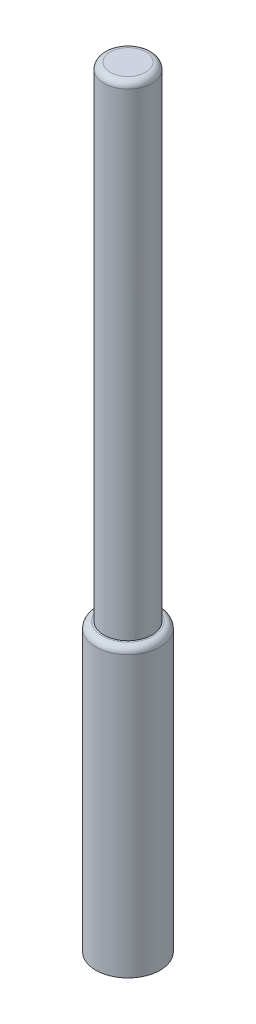
ISO-10303-21;
HEADER;
FILE_DESCRIPTION(('STEP AP214'),'2;1');
FILE_NAME('part.step','',(''),(''),'','','');
FILE_SCHEMA(('AUTOMOTIVE_DESIGN { 1 0 10303 214 1 1 1 1 }'));
ENDSEC;
DATA;
#1=APPLICATION_CONTEXT('core data for automotive mechanical design processes');
#2=APPLICATION_PROTOCOL_DEFINITION('international standard','automotive_design',2000,#1);
#3=PRODUCT_CONTEXT('',#1,'mechanical');
#4=PRODUCT('Part','Part','',(#3));
#5=PRODUCT_RELATED_PRODUCT_CATEGORY('part','',(#4));
#6=PRODUCT_DEFINITION_FORMATION('','',#4);
#7=PRODUCT_DEFINITION_CONTEXT('part definition',#1,'design');
#8=PRODUCT_DEFINITION('design','',#6,#7);
#9=PRODUCT_DEFINITION_SHAPE('','',#8);
#10=(LENGTH_UNIT() NAMED_UNIT(*) SI_UNIT(.MILLI.,.METRE.));
#11=(NAMED_UNIT(*) PLANE_ANGLE_UNIT() SI_UNIT($,.RADIAN.));
#12=(NAMED_UNIT(*) SI_UNIT($,.STERADIAN.) SOLID_ANGLE_UNIT());
#13=UNCERTAINTY_MEASURE_WITH_UNIT(LENGTH_MEASURE(1.E-05),#10,'distance_accuracy_value','');
#14=(GEOMETRIC_REPRESENTATION_CONTEXT(3) GLOBAL_UNCERTAINTY_ASSIGNED_CONTEXT((#13)) GLOBAL_UNIT_ASSIGNED_CONTEXT((#10,
#11,#12)) REPRESENTATION_CONTEXT('',''));
#15=CARTESIAN_POINT('',(0.,0.,0.));
#16=DIRECTION('',(0.,0.,1.));
#17=DIRECTION('',(1.,0.,0.));
#18=AXIS2_PLACEMENT_3D('',#15,#16,#17);
#19=CARTESIAN_POINT('',(0.,56.642,0.));
#20=DIRECTION('',(0.,1.,0.));
#21=DIRECTION('',(0.,0.,1.));
#22=AXIS2_PLACEMENT_3D('',#19,#20,#21);
#23=PLANE('',#22);
#24=CARTESIAN_POINT('',(0.,56.642,0.));
#25=DIRECTION('',(0.,1.,0.));
#26=DIRECTION('',(0.,0.,1.));
#27=AXIS2_PLACEMENT_3D('',#24,#25,#26);
#28=CIRCLE('',#27,5.08);
#29=CARTESIAN_POINT('',(0.,56.642,5.08));
#30=VERTEX_POINT('',#29);
#31=EDGE_CURVE('E64',#30,#30,#28,.T.);
#32=ORIENTED_EDGE('',*,*,#31,.T.);
#33=EDGE_LOOP('',(#32));
#34=FACE_BOUND('',#33,.T.);
#35=CARTESIAN_POINT('',(0.,56.642,0.));
#36=DIRECTION('',(0.,1.,0.));
#37=DIRECTION('',(0.,0.,1.));
#38=AXIS2_PLACEMENT_3D('',#35,#36,#37);
#39=CIRCLE('',#38,4.7625);
#40=CARTESIAN_POINT('',(0.,56.642,-4.7625));
#41=VERTEX_POINT('',#40);
#42=EDGE_CURVE('E72',#41,#41,#39,.T.);
#43=ORIENTED_EDGE('',*,*,#42,.F.);
#44=EDGE_LOOP('',(#43));
#45=FACE_BOUND('',#44,.T.);
#46=ADVANCED_FACE('F49',(#34,#45),#23,.T.);
#47=CARTESIAN_POINT('',(0.,0.,0.));
#48=DIRECTION('',(0.,1.,0.));
#49=DIRECTION('',(0.,0.,1.));
#50=AXIS2_PLACEMENT_3D('',#47,#48,#49);
#51=PLANE('',#50);
#52=CARTESIAN_POINT('',(0.,0.,0.));
#53=DIRECTION('',(0.,1.,0.));
#54=DIRECTION('',(0.,0.,1.));
#55=AXIS2_PLACEMENT_3D('',#52,#53,#54);
#56=CIRCLE('',#55,6.35);
#57=CARTESIAN_POINT('',(0.,0.,6.35));
#58=VERTEX_POINT('',#57);
#59=EDGE_CURVE('E69',#58,#58,#56,.T.);
#60=ORIENTED_EDGE('',*,*,#59,.F.);
#61=EDGE_LOOP('',(#60));
#62=FACE_BOUND('',#61,.T.);
#63=ADVANCED_FACE('F79',(#62),#51,.F.);
#64=CARTESIAN_POINT('',(0.,56.642,0.));
#65=DIRECTION('',(0.,-1.,0.));
#66=DIRECTION('',(0.,0.,-1.));
#67=AXIS2_PLACEMENT_3D('',#64,#65,#66);
#68=CYLINDRICAL_SURFACE('',#67,6.35);
#69=CARTESIAN_POINT('',(0.,55.372,0.));
#70=DIRECTION('',(0.,1.,0.));
#71=DIRECTION('',(0.,0.,1.));
#72=AXIS2_PLACEMENT_3D('',#69,#70,#71);
#73=CIRCLE('',#72,6.35);
#74=CARTESIAN_POINT('',(0.,55.372,6.35));
#75=VERTEX_POINT('',#74);
#76=EDGE_CURVE('E60',#75,#75,#73,.F.);
#77=ORIENTED_EDGE('',*,*,#76,.T.);
#78=EDGE_LOOP('',(#77));
#79=FACE_BOUND('',#78,.T.);
#80=ORIENTED_EDGE('',*,*,#59,.T.);
#81=EDGE_LOOP('',(#80));
#82=FACE_BOUND('',#81,.T.);
#83=ADVANCED_FACE('F86',(#79,#82),#68,.T.);
#84=CARTESIAN_POINT('',(0.,152.4,0.));
#85=DIRECTION('',(0.,-1.,0.));
#86=DIRECTION('',(0.,0.,-1.));
#87=AXIS2_PLACEMENT_3D('',#84,#85,#86);
#88=CYLINDRICAL_SURFACE('',#87,4.7625);
#89=CARTESIAN_POINT('',(0.,151.13,0.));
#90=DIRECTION('',(0.,1.,0.));
#91=DIRECTION('',(0.,0.,1.));
#92=AXIS2_PLACEMENT_3D('',#89,#90,#91);
#93=CIRCLE('',#92,4.7625);
#94=CARTESIAN_POINT('',(0.,151.13,-4.7625));
#95=VERTEX_POINT('',#94);
#96=EDGE_CURVE('E11',#95,#95,#93,.F.);
#97=CARTESIAN_POINT('',(0.,151.13,-4.7625));
#98=CARTESIAN_POINT('',(0.,150.14575,-4.7625));
#99=CARTESIAN_POINT('',(0.,149.1615,-4.7625));
#100=CARTESIAN_POINT('',(0.,147.193,-4.7625));
#101=CARTESIAN_POINT('',(0.,146.20875,-4.7625));
#102=CARTESIAN_POINT('',(0.,144.24025,-4.7625));
#103=CARTESIAN_POINT('',(0.,143.256,-4.7625));
#104=CARTESIAN_POINT('',(0.,141.2875,-4.7625));
#105=CARTESIAN_POINT('',(0.,140.30325,-4.7625));
#106=CARTESIAN_POINT('',(0.,138.33475,-4.7625));
#107=CARTESIAN_POINT('',(0.,137.3505,-4.7625));
#108=CARTESIAN_POINT('',(0.,135.382,-4.7625));
#109=CARTESIAN_POINT('',(0.,134.39775,-4.7625));
#110=CARTESIAN_POINT('',(0.,132.42925,-4.7625));
#111=CARTESIAN_POINT('',(0.,131.445,-4.7625));
#112=CARTESIAN_POINT('',(0.,129.4765,-4.7625));
#113=CARTESIAN_POINT('',(0.,128.49225,-4.7625));
#114=CARTESIAN_POINT('',(0.,126.52375,-4.7625));
#115=CARTESIAN_POINT('',(0.,125.5395,-4.7625));
#116=CARTESIAN_POINT('',(0.,123.571,-4.7625));
#117=CARTESIAN_POINT('',(0.,122.58675,-4.7625));
#118=CARTESIAN_POINT('',(0.,120.61825,-4.7625));
#119=CARTESIAN_POINT('',(0.,119.634,-4.7625));
#120=CARTESIAN_POINT('',(0.,117.6655,-4.7625));
#121=CARTESIAN_POINT('',(0.,116.68125,-4.7625));
#122=CARTESIAN_POINT('',(0.,114.71275,-4.7625));
#123=CARTESIAN_POINT('',(0.,113.7285,-4.7625));
#124=CARTESIAN_POINT('',(0.,111.76,-4.7625));
#125=CARTESIAN_POINT('',(0.,110.77575,-4.7625));
#126=CARTESIAN_POINT('',(0.,108.80725,-4.7625));
#127=CARTESIAN_POINT('',(0.,107.823,-4.7625));
#128=CARTESIAN_POINT('',(0.,105.8545,-4.7625));
#129=CARTESIAN_POINT('',(0.,104.87025,-4.7625));
#130=CARTESIAN_POINT('',(0.,102.90175,-4.7625));
#131=CARTESIAN_POINT('',(0.,101.9175,-4.7625));
#132=CARTESIAN_POINT('',(0.,99.949,-4.7625));
#133=CARTESIAN_POINT('',(0.,98.96475,-4.7625));
#134=CARTESIAN_POINT('',(0.,96.99625,-4.7625));
#135=CARTESIAN_POINT('',(0.,96.012,-4.7625));
#136=CARTESIAN_POINT('',(0.,94.0435,-4.7625));
#137=CARTESIAN_POINT('',(0.,93.05925,-4.7625));
#138=CARTESIAN_POINT('',(0.,91.09075,-4.7625));
#139=CARTESIAN_POINT('',(0.,90.1065,-4.7625));
#140=CARTESIAN_POINT('',(0.,88.138,-4.7625));
#141=CARTESIAN_POINT('',(0.,87.15375,-4.7625));
#142=CARTESIAN_POINT('',(0.,85.18525,-4.7625));
#143=CARTESIAN_POINT('',(0.,84.201,-4.7625));
#144=CARTESIAN_POINT('',(0.,82.2325,-4.7625));
#145=CARTESIAN_POINT('',(0.,81.24825,-4.7625));
#146=CARTESIAN_POINT('',(0.,79.27975,-4.7625));
#147=CARTESIAN_POINT('',(0.,78.2955,-4.7625));
#148=CARTESIAN_POINT('',(0.,76.327,-4.7625));
#149=CARTESIAN_POINT('',(0.,75.34275,-4.7625));
#150=CARTESIAN_POINT('',(0.,73.37425,-4.7625));
#151=CARTESIAN_POINT('',(0.,72.39,-4.7625));
#152=CARTESIAN_POINT('',(0.,70.4215,-4.7625));
#153=CARTESIAN_POINT('',(0.,69.43725,-4.7625));
#154=CARTESIAN_POINT('',(0.,67.46875,-4.7625));
#155=CARTESIAN_POINT('',(0.,66.4845,-4.7625));
#156=CARTESIAN_POINT('',(0.,64.516,-4.7625));
#157=CARTESIAN_POINT('',(0.,63.53175,-4.7625));
#158=CARTESIAN_POINT('',(0.,61.56325,-4.7625));
#159=CARTESIAN_POINT('',(0.,60.579,-4.7625));
#160=CARTESIAN_POINT('',(0.,58.6105,-4.7625));
#161=CARTESIAN_POINT('',(0.,57.62625,-4.7625));
#162=CARTESIAN_POINT('',(0.,56.642,-4.7625));
#163=B_SPLINE_CURVE_WITH_KNOTS('',3,(#97,#98,#99,#100,#101,#102,#103,#104,#105,#106,#107,#108,
#109,#110,#111,#112,#113,#114,#115,#116,#117,#118,#119,#120,#121,#122,#123,#124,#125,#126,#127,
#128,#129,#130,#131,#132,#133,#134,#135,#136,#137,#138,#139,#140,#141,#142,#143,#144,#145,#146,
#147,#148,#149,#150,#151,#152,#153,#154,#155,#156,#157,#158,#159,#160,#161,#162),.UNSPECIFIED.,
.F.,.F.,(4,2,2,2,2,2,2,2,2,2,2,2,2,2,2,2,2,2,2,2,2,2,2,2,2,2,2,2,2,2,2,2,4),(0.,2.95275,
5.90550000000001,8.85825000000001,11.811,14.76375,17.7165,20.66925,23.622,26.57475,29.5275,
32.48025,35.433,38.38575,41.3385,44.29125,47.244,50.19675,53.1495,56.10225,59.055,62.00775,
64.9605,67.91325,70.866,73.81875,76.7715,79.72425,82.677,85.62975,88.5825,91.53525,94.488),.UNSPECIFIED.);
#164=EDGE_CURVE('BSEAM76',#95,#41,#163,.T.);
#165=ORIENTED_EDGE('',*,*,#96,.T.);
#166=ORIENTED_EDGE('',*,*,#42,.T.);
#167=ORIENTED_EDGE('',*,*,#164,.T.);
#168=ORIENTED_EDGE('',*,*,#164,.F.);
#169=EDGE_LOOP('',(#165,#167,#166,#168));
#170=FACE_BOUND('',#169,.T.);
#171=ADVANCED_FACE('F76',(#170),#88,.T.);
#172=CARTESIAN_POINT('',(0.,152.4,0.));
#173=DIRECTION('',(0.,1.,0.));
#174=DIRECTION('',(0.,0.,1.));
#175=AXIS2_PLACEMENT_3D('',#172,#173,#174);
#176=PLANE('',#175);
#177=CARTESIAN_POINT('',(0.,152.4,0.));
#178=DIRECTION('',(0.,1.,0.));
#179=DIRECTION('',(0.,0.,1.));
#180=AXIS2_PLACEMENT_3D('',#177,#178,#179);
#181=CIRCLE('',#180,3.4925);
#182=CARTESIAN_POINT('',(0.,152.4,3.4925));
#183=VERTEX_POINT('',#182);
#184=EDGE_CURVE('E56',#183,#183,#181,.T.);
#185=ORIENTED_EDGE('',*,*,#184,.T.);
#186=EDGE_LOOP('',(#185));
#187=FACE_BOUND('',#186,.T.);
#188=ADVANCED_FACE('F95',(#187),#176,.T.);
#189=CARTESIAN_POINT('',(0.,55.372,0.));
#190=DIRECTION('',(0.,1.,0.));
#191=DIRECTION('',(0.,0.,1.));
#192=AXIS2_PLACEMENT_3D('',#189,#190,#191);
#193=TOROIDAL_SURFACE('',#192,5.08,1.27);
#194=ORIENTED_EDGE('',*,*,#76,.F.);
#195=EDGE_LOOP('',(#194));
#196=FACE_BOUND('',#195,.T.);
#197=ORIENTED_EDGE('',*,*,#31,.F.);
#198=EDGE_LOOP('',(#197));
#199=FACE_BOUND('',#198,.T.);
#200=ADVANCED_FACE('F93',(#196,#199),#193,.T.);
#201=CARTESIAN_POINT('',(0.,151.13,0.));
#202=DIRECTION('',(0.,1.,0.));
#203=DIRECTION('',(0.,0.,1.));
#204=AXIS2_PLACEMENT_3D('',#201,#202,#203);
#205=TOROIDAL_SURFACE('',#204,3.4925,1.27);
#206=ORIENTED_EDGE('',*,*,#96,.F.);
#207=EDGE_LOOP('',(#206));
#208=FACE_BOUND('',#207,.T.);
#209=ORIENTED_EDGE('',*,*,#184,.F.);
#210=EDGE_LOOP('',(#209));
#211=FACE_BOUND('',#210,.T.);
#212=ADVANCED_FACE('F51',(#208,#211),#205,.T.);
#213=CLOSED_SHELL('',(#46,#63,#83,#171,#188,#200,#212));
#214=MANIFOLD_SOLID_BREP('B2',#213);
#215=ADVANCED_BREP_SHAPE_REPRESENTATION('',(#18,#214),#14);
#216=SHAPE_DEFINITION_REPRESENTATION(#9,#215);
ENDSEC;
END-ISO-10303-21;
